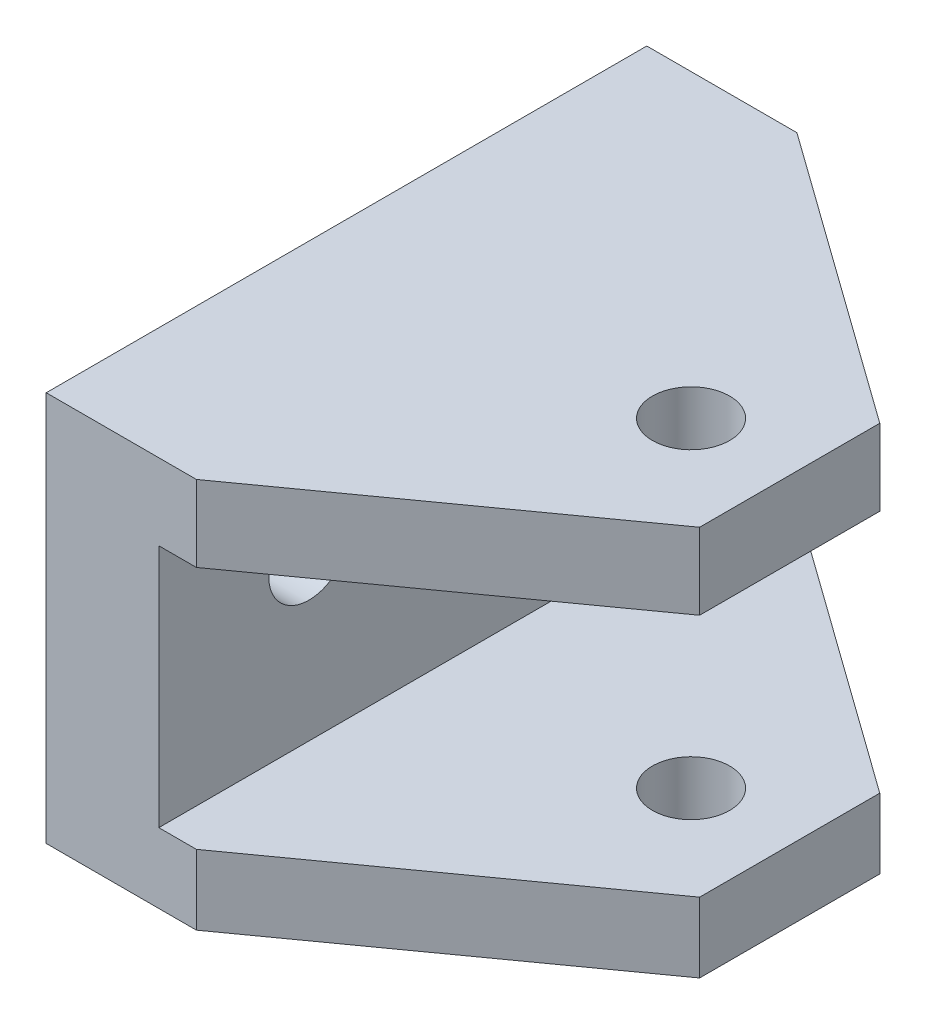
ISO-10303-21;
HEADER;
FILE_DESCRIPTION(('STEP AP214'),'2;1');
FILE_NAME('part.step','',(''),(''),'','','');
FILE_SCHEMA(('AUTOMOTIVE_DESIGN { 1 0 10303 214 1 1 1 1 }'));
ENDSEC;
DATA;
#1=APPLICATION_CONTEXT('core data for automotive mechanical design processes');
#2=APPLICATION_PROTOCOL_DEFINITION('international standard','automotive_design',2000,#1);
#3=PRODUCT_CONTEXT('',#1,'mechanical');
#4=PRODUCT('Part','Part','',(#3));
#5=PRODUCT_RELATED_PRODUCT_CATEGORY('part','',(#4));
#6=PRODUCT_DEFINITION_FORMATION('','',#4);
#7=PRODUCT_DEFINITION_CONTEXT('part definition',#1,'design');
#8=PRODUCT_DEFINITION('design','',#6,#7);
#9=PRODUCT_DEFINITION_SHAPE('','',#8);
#10=(LENGTH_UNIT() NAMED_UNIT(*) SI_UNIT(.MILLI.,.METRE.));
#11=(NAMED_UNIT(*) PLANE_ANGLE_UNIT() SI_UNIT($,.RADIAN.));
#12=(NAMED_UNIT(*) SI_UNIT($,.STERADIAN.) SOLID_ANGLE_UNIT());
#13=UNCERTAINTY_MEASURE_WITH_UNIT(LENGTH_MEASURE(1.E-05),#10,'distance_accuracy_value','');
#14=(GEOMETRIC_REPRESENTATION_CONTEXT(3) GLOBAL_UNCERTAINTY_ASSIGNED_CONTEXT((#13)) GLOBAL_UNIT_ASSIGNED_CONTEXT((#10,
#11,#12)) REPRESENTATION_CONTEXT('',''));
#15=CARTESIAN_POINT('',(0.,0.,0.));
#16=DIRECTION('',(0.,0.,1.));
#17=DIRECTION('',(1.,0.,0.));
#18=AXIS2_PLACEMENT_3D('',#15,#16,#17);
#19=CARTESIAN_POINT('',(0.,1.79164753652166,50.8));
#20=DIRECTION('',(0.,1.,0.));
#21=DIRECTION('',(0.,0.,1.));
#22=AXIS2_PLACEMENT_3D('',#19,#20,#21);
#23=PLANE('',#22);
#24=CARTESIAN_POINT('',(29.1452579658035,1.79164753652166,25.4));
#25=DIRECTION('',(0.,1.,0.));
#26=DIRECTION('',(0.,0.,1.));
#27=AXIS2_PLACEMENT_3D('',#24,#25,#26);
#28=CIRCLE('',#27,3.2639);
#29=CARTESIAN_POINT('',(29.1452579658035,1.79164753652166,28.6639));
#30=VERTEX_POINT('',#29);
#31=EDGE_CURVE('E304',#30,#30,#28,.F.);
#32=ORIENTED_EDGE('',*,*,#31,.F.);
#33=EDGE_LOOP('',(#32));
#34=FACE_BOUND('',#33,.T.);
#35=DIRECTION('',(0.,0.,-1.));
#36=VECTOR('',#35,1.);
#37=CARTESIAN_POINT('',(37.4891579658035,1.79164753652166,17.78));
#38=LINE('',#37,#36);
#39=CARTESIAN_POINT('',(37.4891579658035,1.79164753652166,33.02));
#40=VERTEX_POINT('',#39);
#41=CARTESIAN_POINT('',(37.4891579658035,1.79164753652165,17.78));
#42=VERTEX_POINT('',#41);
#43=EDGE_CURVE('E292',#40,#42,#38,.T.);
#44=ORIENTED_EDGE('',*,*,#43,.F.);
#45=DIRECTION('',(0.812592996843256,0.,-0.582831554980765));
#46=VECTOR('',#45,1.);
#47=CARTESIAN_POINT('',(37.4891579658035,1.79164753652166,33.02));
#48=LINE('',#47,#46);
#49=CARTESIAN_POINT('',(12.7,1.79164753652166,50.8));
#50=VERTEX_POINT('',#49);
#51=EDGE_CURVE('E273',#50,#40,#48,.T.);
#52=ORIENTED_EDGE('',*,*,#51,.F.);
#53=DIRECTION('',(1.,0.,0.));
#54=VECTOR('',#53,1.);
#55=CARTESIAN_POINT('',(0.,1.79164753652166,50.8));
#56=LINE('',#55,#54);
#57=CARTESIAN_POINT('',(0.,1.79164753652166,50.8));
#58=VERTEX_POINT('',#57);
#59=EDGE_CURVE('E165',#58,#50,#56,.T.);
#60=ORIENTED_EDGE('',*,*,#59,.F.);
#61=DIRECTION('',(0.,0.,-1.));
#62=VECTOR('',#61,1.);
#63=CARTESIAN_POINT('',(0.,1.79164753652166,50.8));
#64=LINE('',#63,#62);
#65=CARTESIAN_POINT('',(0.,1.79164753652166,0.));
#66=VERTEX_POINT('',#65);
#67=EDGE_CURVE('E171',#58,#66,#64,.T.);
#68=ORIENTED_EDGE('',*,*,#67,.T.);
#69=DIRECTION('',(1.,0.,0.));
#70=VECTOR('',#69,1.);
#71=CARTESIAN_POINT('',(0.,1.79164753652166,0.));
#72=LINE('',#71,#70);
#73=CARTESIAN_POINT('',(12.7,1.79164753652166,0.));
#74=VERTEX_POINT('',#73);
#75=EDGE_CURVE('E194',#66,#74,#72,.T.);
#76=ORIENTED_EDGE('',*,*,#75,.T.);
#77=DIRECTION('',(-0.812592996843256,0.,-0.582831554980765));
#78=VECTOR('',#77,1.);
#79=CARTESIAN_POINT('',(12.7,1.79164753652166,0.));
#80=LINE('',#79,#78);
#81=EDGE_CURVE('E68',#42,#74,#80,.T.);
#82=ORIENTED_EDGE('',*,*,#81,.F.);
#83=EDGE_LOOP('',(#44,#52,#60,#68,#76,#82));
#84=FACE_BOUND('',#83,.T.);
#85=ADVANCED_FACE('F45',(#34,#84),#23,.F.);
#86=CARTESIAN_POINT('',(9.52499999999999,7.71347230024182,50.8));
#87=DIRECTION('',(4.66310559007069E-13,-1.,0.));
#88=DIRECTION('',(1.,4.66310559007069E-13,0.));
#89=AXIS2_PLACEMENT_3D('',#86,#87,#88);
#90=PLANE('',#89);
#91=CARTESIAN_POINT('',(29.1452579658035,7.71347230025096,25.4));
#92=DIRECTION('',(4.66310559007069E-13,-1.,0.));
#93=DIRECTION('',(1.,4.66310559007069E-13,0.));
#94=AXIS2_PLACEMENT_3D('',#91,#92,#93);
#95=CIRCLE('',#94,3.2639);
#96=CARTESIAN_POINT('',(29.1452579658035,7.71347230025096,28.6639));
#97=VERTEX_POINT('',#96);
#98=EDGE_CURVE('E241',#97,#97,#95,.T.);
#99=ORIENTED_EDGE('',*,*,#98,.T.);
#100=EDGE_LOOP('',(#99));
#101=FACE_BOUND('',#100,.T.);
#102=DIRECTION('',(-1.,-4.66310559007069E-13,0.));
#103=VECTOR('',#102,1.);
#104=CARTESIAN_POINT('',(9.52499999999999,7.71347230024182,50.8));
#105=LINE('',#104,#103);
#106=CARTESIAN_POINT('',(12.7,7.71347230024932,50.8));
#107=VERTEX_POINT('',#106);
#108=CARTESIAN_POINT('',(9.52499999999999,7.71347230024182,50.8));
#109=VERTEX_POINT('',#108);
#110=EDGE_CURVE('E229',#107,#109,#105,.T.);
#111=ORIENTED_EDGE('',*,*,#110,.F.);
#112=DIRECTION('',(0.812592996843256,3.78920694603208E-13,-0.582831554980765));
#113=VECTOR('',#112,1.);
#114=CARTESIAN_POINT('',(10.6035240732031,7.71347230024233,52.3036953667353));
#115=LINE('',#114,#113);
#116=CARTESIAN_POINT('',(37.4891579658035,7.71347230025483,33.02));
#117=VERTEX_POINT('',#116);
#118=EDGE_CURVE('E259',#107,#117,#115,.T.);
#119=ORIENTED_EDGE('',*,*,#118,.T.);
#120=DIRECTION('',(0.,0.,-1.));
#121=VECTOR('',#120,1.);
#122=CARTESIAN_POINT('',(37.4891579658035,7.71347230025486,50.8));
#123=LINE('',#122,#121);
#124=CARTESIAN_POINT('',(37.4891579658035,7.71347230024906,17.78));
#125=VERTEX_POINT('',#124);
#126=EDGE_CURVE('E252',#117,#125,#123,.T.);
#127=ORIENTED_EDGE('',*,*,#126,.T.);
#128=DIRECTION('',(-0.812592996843256,-3.78920694603208E-13,-0.582831554980765));
#129=VECTOR('',#128,1.);
#130=CARTESIAN_POINT('',(34.6626499409682,7.71347230025354,15.7526898045146));
#131=LINE('',#130,#129);
#132=CARTESIAN_POINT('',(12.7,7.71347230024932,0.));
#133=VERTEX_POINT('',#132);
#134=EDGE_CURVE('E265',#125,#133,#131,.T.);
#135=ORIENTED_EDGE('',*,*,#134,.T.);
#136=DIRECTION('',(-1.,-4.66310559007069E-13,0.));
#137=VECTOR('',#136,1.);
#138=CARTESIAN_POINT('',(9.52499999999999,7.71347230024182,0.));
#139=LINE('',#138,#137);
#140=CARTESIAN_POINT('',(9.52499999999999,7.71347230024182,0.));
#141=VERTEX_POINT('',#140);
#142=EDGE_CURVE('E199',#133,#141,#139,.T.);
#143=ORIENTED_EDGE('',*,*,#142,.T.);
#144=DIRECTION('',(0.,0.,-1.));
#145=VECTOR('',#144,1.);
#146=CARTESIAN_POINT('',(9.52499999999999,7.71347230024182,50.8));
#147=LINE('',#146,#145);
#148=EDGE_CURVE('E143',#109,#141,#147,.T.);
#149=ORIENTED_EDGE('',*,*,#148,.F.);
#150=EDGE_LOOP('',(#111,#119,#127,#135,#143,#149));
#151=FACE_BOUND('',#150,.T.);
#152=ADVANCED_FACE('F313',(#101,#151),#90,.F.);
#153=CARTESIAN_POINT('',(9.52499999999998,28.3636723002418,50.8));
#154=DIRECTION('',(-1.,0.,0.));
#155=DIRECTION('',(0.,-1.,0.));
#156=AXIS2_PLACEMENT_3D('',#153,#154,#155);
#157=PLANE('',#156);
#158=CARTESIAN_POINT('',(9.52499999999999,21.4304608809537,38.1));
#159=DIRECTION('',(1.,0.,0.));
#160=DIRECTION('',(0.,0.,-1.));
#161=AXIS2_PLACEMENT_3D('',#158,#159,#160);
#162=CIRCLE('',#161,3.4);
#163=CARTESIAN_POINT('',(9.52499999999999,21.4304608809537,34.7));
#164=VERTEX_POINT('',#163);
#165=EDGE_CURVE('E191',#164,#164,#162,.T.);
#166=ORIENTED_EDGE('',*,*,#165,.F.);
#167=EDGE_LOOP('',(#166));
#168=FACE_BOUND('',#167,.T.);
#169=CARTESIAN_POINT('',(9.52499999999999,21.4304608809537,12.7));
#170=DIRECTION('',(1.,0.,0.));
#171=DIRECTION('',(0.,0.,-1.));
#172=AXIS2_PLACEMENT_3D('',#169,#170,#171);
#173=CIRCLE('',#172,3.4);
#174=CARTESIAN_POINT('',(9.52499999999999,21.4304608809537,9.3));
#175=VERTEX_POINT('',#174);
#176=EDGE_CURVE('E237',#175,#175,#173,.T.);
#177=ORIENTED_EDGE('',*,*,#176,.F.);
#178=EDGE_LOOP('',(#177));
#179=FACE_BOUND('',#178,.T.);
#180=DIRECTION('',(0.,1.,0.));
#181=VECTOR('',#180,1.);
#182=CARTESIAN_POINT('',(9.52499999999998,28.3636723002418,0.));
#183=LINE('',#182,#181);
#184=CARTESIAN_POINT('',(9.52499999999998,28.3636723002418,0.));
#185=VERTEX_POINT('',#184);
#186=EDGE_CURVE('E167',#141,#185,#183,.T.);
#187=ORIENTED_EDGE('',*,*,#186,.T.);
#188=DIRECTION('',(0.,0.,-1.));
#189=VECTOR('',#188,1.);
#190=CARTESIAN_POINT('',(9.52499999999998,28.3636723002418,50.8));
#191=LINE('',#190,#189);
#192=CARTESIAN_POINT('',(9.52499999999998,28.3636723002418,50.8));
#193=VERTEX_POINT('',#192);
#194=EDGE_CURVE('E179',#193,#185,#191,.T.);
#195=ORIENTED_EDGE('',*,*,#194,.F.);
#196=DIRECTION('',(0.,1.,0.));
#197=VECTOR('',#196,1.);
#198=CARTESIAN_POINT('',(9.52499999999998,28.3636723002418,50.8));
#199=LINE('',#198,#197);
#200=EDGE_CURVE('E225',#109,#193,#199,.T.);
#201=ORIENTED_EDGE('',*,*,#200,.F.);
#202=ORIENTED_EDGE('',*,*,#148,.T.);
#203=EDGE_LOOP('',(#187,#195,#201,#202));
#204=FACE_BOUND('',#203,.T.);
#205=ADVANCED_FACE('F210',(#168,#179,#204),#157,.F.);
#206=CARTESIAN_POINT('',(41.8452579658035,28.3636723002569,50.8));
#207=DIRECTION('',(-4.66417904900026E-13,1.,0.));
#208=DIRECTION('',(-1.,-4.66417904900026E-13,0.));
#209=AXIS2_PLACEMENT_3D('',#206,#207,#208);
#210=PLANE('',#209);
#211=CARTESIAN_POINT('',(29.1452579658035,28.363672300251,25.4));
#212=DIRECTION('',(-4.66417904900026E-13,1.,0.));
#213=DIRECTION('',(-1.,-4.66417904900026E-13,0.));
#214=AXIS2_PLACEMENT_3D('',#211,#212,#213);
#215=CIRCLE('',#214,3.2639);
#216=CARTESIAN_POINT('',(29.1452579658035,28.363672300251,28.6639));
#217=VERTEX_POINT('',#216);
#218=EDGE_CURVE('E248',#217,#217,#215,.T.);
#219=ORIENTED_EDGE('',*,*,#218,.T.);
#220=EDGE_LOOP('',(#219));
#221=FACE_BOUND('',#220,.T.);
#222=DIRECTION('',(0.,0.,1.));
#223=VECTOR('',#222,1.);
#224=CARTESIAN_POINT('',(37.4891579658035,28.3636723002549,50.8));
#225=LINE('',#224,#223);
#226=CARTESIAN_POINT('',(37.4891579658035,28.363672300249,17.78));
#227=VERTEX_POINT('',#226);
#228=CARTESIAN_POINT('',(37.4891579658035,28.3636723002548,33.02));
#229=VERTEX_POINT('',#228);
#230=EDGE_CURVE('E256',#227,#229,#225,.T.);
#231=ORIENTED_EDGE('',*,*,#230,.T.);
#232=DIRECTION('',(-0.812592996843256,-3.79007923124065E-13,0.582831554980765));
#233=VECTOR('',#232,1.);
#234=CARTESIAN_POINT('',(31.9448288836511,28.3636723002523,36.9966647667766));
#235=LINE('',#234,#233);
#236=CARTESIAN_POINT('',(12.7,28.3636723002493,50.8));
#237=VERTEX_POINT('',#236);
#238=EDGE_CURVE('E221',#229,#237,#235,.T.);
#239=ORIENTED_EDGE('',*,*,#238,.T.);
#240=DIRECTION('',(1.,4.66417904900026E-13,0.));
#241=VECTOR('',#240,1.);
#242=CARTESIAN_POINT('',(41.8452579658035,28.3636723002569,50.8));
#243=LINE('',#242,#241);
#244=EDGE_CURVE('E220',#193,#237,#243,.T.);
#245=ORIENTED_EDGE('',*,*,#244,.F.);
#246=ORIENTED_EDGE('',*,*,#194,.T.);
#247=DIRECTION('',(1.,4.66417904900026E-13,0.));
#248=VECTOR('',#247,1.);
#249=CARTESIAN_POINT('',(41.8452579658035,28.3636723002569,0.));
#250=LINE('',#249,#248);
#251=CARTESIAN_POINT('',(12.7,28.3636723002433,0.));
#252=VERTEX_POINT('',#251);
#253=EDGE_CURVE('E161',#185,#252,#250,.T.);
#254=ORIENTED_EDGE('',*,*,#253,.T.);
#255=DIRECTION('',(0.812592996843256,3.79007923124065E-13,0.582831554980765));
#256=VECTOR('',#255,1.);
#257=CARTESIAN_POINT('',(56.0039547514161,28.3636723002635,31.0597204044733));
#258=LINE('',#257,#256);
#259=EDGE_CURVE('E60',#252,#227,#258,.T.);
#260=ORIENTED_EDGE('',*,*,#259,.T.);
#261=EDGE_LOOP('',(#231,#239,#245,#246,#254,#260));
#262=FACE_BOUND('',#261,.T.);
#263=ADVANCED_FACE('F217',(#221,#262),#210,.F.);
#264=CARTESIAN_POINT('',(0.,34.8116475365217,50.8));
#265=DIRECTION('',(0.,-1.,0.));
#266=DIRECTION('',(0.,0.,-1.));
#267=AXIS2_PLACEMENT_3D('',#264,#265,#266);
#268=PLANE('',#267);
#269=CARTESIAN_POINT('',(29.1452579658035,34.8116475365217,25.4));
#270=DIRECTION('',(0.,1.,0.));
#271=DIRECTION('',(0.,0.,1.));
#272=AXIS2_PLACEMENT_3D('',#269,#270,#271);
#273=CIRCLE('',#272,3.2639);
#274=CARTESIAN_POINT('',(29.1452579658035,34.8116475365217,28.6639));
#275=VERTEX_POINT('',#274);
#276=EDGE_CURVE('E154',#275,#275,#273,.T.);
#277=ORIENTED_EDGE('',*,*,#276,.F.);
#278=EDGE_LOOP('',(#277));
#279=FACE_BOUND('',#278,.T.);
#280=DIRECTION('',(-1.,0.,0.));
#281=VECTOR('',#280,1.);
#282=CARTESIAN_POINT('',(0.,34.8116475365217,50.8));
#283=LINE('',#282,#281);
#284=CARTESIAN_POINT('',(12.7,34.8116475365217,50.8));
#285=VERTEX_POINT('',#284);
#286=CARTESIAN_POINT('',(0.,34.8116475365217,50.8));
#287=VERTEX_POINT('',#286);
#288=EDGE_CURVE('E224',#285,#287,#283,.T.);
#289=ORIENTED_EDGE('',*,*,#288,.F.);
#290=DIRECTION('',(-0.812592996843256,0.,0.582831554980765));
#291=VECTOR('',#290,1.);
#292=CARTESIAN_POINT('',(37.4891579658035,34.8116475365217,33.02));
#293=LINE('',#292,#291);
#294=CARTESIAN_POINT('',(37.4891579658035,34.8116475365217,33.02));
#295=VERTEX_POINT('',#294);
#296=EDGE_CURVE('E278',#295,#285,#293,.T.);
#297=ORIENTED_EDGE('',*,*,#296,.F.);
#298=DIRECTION('',(0.,0.,1.));
#299=VECTOR('',#298,1.);
#300=CARTESIAN_POINT('',(37.4891579658035,34.8116475365217,17.78));
#301=LINE('',#300,#299);
#302=CARTESIAN_POINT('',(37.4891579658035,34.8116475365217,17.78));
#303=VERTEX_POINT('',#302);
#304=EDGE_CURVE('E152',#303,#295,#301,.T.);
#305=ORIENTED_EDGE('',*,*,#304,.F.);
#306=DIRECTION('',(0.812592996843256,0.,0.582831554980765));
#307=VECTOR('',#306,1.);
#308=CARTESIAN_POINT('',(12.7,34.8116475365217,0.));
#309=LINE('',#308,#307);
#310=CARTESIAN_POINT('',(12.7,34.8116475365217,0.));
#311=VERTEX_POINT('',#310);
#312=EDGE_CURVE('E136',#311,#303,#309,.T.);
#313=ORIENTED_EDGE('',*,*,#312,.F.);
#314=DIRECTION('',(-1.,0.,0.));
#315=VECTOR('',#314,1.);
#316=CARTESIAN_POINT('',(0.,34.8116475365217,0.));
#317=LINE('',#316,#315);
#318=CARTESIAN_POINT('',(0.,34.8116475365217,0.));
#319=VERTEX_POINT('',#318);
#320=EDGE_CURVE('E148',#311,#319,#317,.T.);
#321=ORIENTED_EDGE('',*,*,#320,.T.);
#322=DIRECTION('',(0.,0.,-1.));
#323=VECTOR('',#322,1.);
#324=CARTESIAN_POINT('',(0.,34.8116475365217,50.8));
#325=LINE('',#324,#323);
#326=EDGE_CURVE('E175',#287,#319,#325,.T.);
#327=ORIENTED_EDGE('',*,*,#326,.F.);
#328=EDGE_LOOP('',(#289,#297,#305,#313,#321,#327));
#329=FACE_BOUND('',#328,.T.);
#330=ADVANCED_FACE('F146',(#279,#329),#268,.F.);
#331=CARTESIAN_POINT('',(0.,1.79164753652166,50.8));
#332=DIRECTION('',(1.,0.,0.));
#333=DIRECTION('',(0.,0.,-1.));
#334=AXIS2_PLACEMENT_3D('',#331,#332,#333);
#335=PLANE('',#334);
#336=CARTESIAN_POINT('',(0.,21.4304608809537,38.1));
#337=DIRECTION('',(1.,0.,0.));
#338=DIRECTION('',(0.,0.,-1.));
#339=AXIS2_PLACEMENT_3D('',#336,#337,#338);
#340=CIRCLE('',#339,3.4);
#341=CARTESIAN_POINT('',(0.,21.4304608809537,34.7));
#342=VERTEX_POINT('',#341);
#343=EDGE_CURVE('E190',#342,#342,#340,.T.);
#344=ORIENTED_EDGE('',*,*,#343,.T.);
#345=EDGE_LOOP('',(#344));
#346=FACE_BOUND('',#345,.T.);
#347=CARTESIAN_POINT('',(0.,21.4304608809537,12.7));
#348=DIRECTION('',(1.,0.,0.));
#349=DIRECTION('',(0.,0.,-1.));
#350=AXIS2_PLACEMENT_3D('',#347,#348,#349);
#351=CIRCLE('',#350,3.4);
#352=CARTESIAN_POINT('',(0.,21.4304608809537,9.3));
#353=VERTEX_POINT('',#352);
#354=EDGE_CURVE('E186',#353,#353,#351,.T.);
#355=ORIENTED_EDGE('',*,*,#354,.T.);
#356=EDGE_LOOP('',(#355));
#357=FACE_BOUND('',#356,.T.);
#358=DIRECTION('',(0.,-1.,0.));
#359=VECTOR('',#358,1.);
#360=CARTESIAN_POINT('',(0.,1.79164753652166,0.));
#361=LINE('',#360,#359);
#362=EDGE_CURVE('E159',#319,#66,#361,.T.);
#363=ORIENTED_EDGE('',*,*,#362,.T.);
#364=ORIENTED_EDGE('',*,*,#67,.F.);
#365=DIRECTION('',(0.,-1.,0.));
#366=VECTOR('',#365,1.);
#367=CARTESIAN_POINT('',(0.,1.79164753652166,50.8));
#368=LINE('',#367,#366);
#369=EDGE_CURVE('E176',#287,#58,#368,.T.);
#370=ORIENTED_EDGE('',*,*,#369,.F.);
#371=ORIENTED_EDGE('',*,*,#326,.T.);
#372=EDGE_LOOP('',(#363,#364,#370,#371));
#373=FACE_BOUND('',#372,.T.);
#374=ADVANCED_FACE('F329',(#346,#357,#373),#335,.F.);
#375=CARTESIAN_POINT('',(0.,0.,50.8));
#376=DIRECTION('',(0.,0.,-1.));
#377=DIRECTION('',(-1.,0.,0.));
#378=AXIS2_PLACEMENT_3D('',#375,#376,#377);
#379=PLANE('',#378);
#380=ORIENTED_EDGE('',*,*,#59,.T.);
#381=DIRECTION('',(0.,1.,0.));
#382=VECTOR('',#381,1.);
#383=CARTESIAN_POINT('',(12.7,-56.7752890565189,50.8));
#384=LINE('',#383,#382);
#385=EDGE_CURVE('E288',#50,#107,#384,.T.);
#386=ORIENTED_EDGE('',*,*,#385,.T.);
#387=ORIENTED_EDGE('',*,*,#110,.T.);
#388=ORIENTED_EDGE('',*,*,#200,.T.);
#389=ORIENTED_EDGE('',*,*,#244,.T.);
#390=DIRECTION('',(0.,1.,0.));
#391=VECTOR('',#390,1.);
#392=CARTESIAN_POINT('',(12.7,0.,50.8));
#393=LINE('',#392,#391);
#394=EDGE_CURVE('E11',#237,#285,#393,.T.);
#395=ORIENTED_EDGE('',*,*,#394,.T.);
#396=ORIENTED_EDGE('',*,*,#288,.T.);
#397=ORIENTED_EDGE('',*,*,#369,.T.);
#398=EDGE_LOOP('',(#380,#386,#387,#388,#389,#395,#396,#397));
#399=FACE_BOUND('',#398,.T.);
#400=ADVANCED_FACE('F325',(#399),#379,.F.);
#401=CARTESIAN_POINT('',(0.,0.,0.));
#402=DIRECTION('',(0.,0.,-1.));
#403=DIRECTION('',(-1.,0.,0.));
#404=AXIS2_PLACEMENT_3D('',#401,#402,#403);
#405=PLANE('',#404);
#406=DIRECTION('',(0.,1.,0.));
#407=VECTOR('',#406,1.);
#408=CARTESIAN_POINT('',(12.7,-56.7752890565189,0.));
#409=LINE('',#408,#407);
#410=EDGE_CURVE('E274',#74,#133,#409,.T.);
#411=ORIENTED_EDGE('',*,*,#410,.F.);
#412=ORIENTED_EDGE('',*,*,#75,.F.);
#413=ORIENTED_EDGE('',*,*,#362,.F.);
#414=ORIENTED_EDGE('',*,*,#320,.F.);
#415=DIRECTION('',(0.,1.,0.));
#416=VECTOR('',#415,1.);
#417=CARTESIAN_POINT('',(12.7,0.,0.));
#418=LINE('',#417,#416);
#419=EDGE_CURVE('E53',#252,#311,#418,.T.);
#420=ORIENTED_EDGE('',*,*,#419,.F.);
#421=ORIENTED_EDGE('',*,*,#253,.F.);
#422=ORIENTED_EDGE('',*,*,#186,.F.);
#423=ORIENTED_EDGE('',*,*,#142,.F.);
#424=EDGE_LOOP('',(#411,#412,#413,#414,#420,#421,#422,#423));
#425=FACE_BOUND('',#424,.T.);
#426=ADVANCED_FACE('F157',(#425),#405,.T.);
#427=CARTESIAN_POINT('',(-41.275,21.4304608809537,12.7));
#428=DIRECTION('',(1.,0.,0.));
#429=DIRECTION('',(0.,0.,-1.));
#430=AXIS2_PLACEMENT_3D('',#427,#428,#429);
#431=CYLINDRICAL_SURFACE('',#430,3.4);
#432=ORIENTED_EDGE('',*,*,#176,.T.);
#433=EDGE_LOOP('',(#432));
#434=FACE_BOUND('',#433,.T.);
#435=ORIENTED_EDGE('',*,*,#354,.F.);
#436=EDGE_LOOP('',(#435));
#437=FACE_BOUND('',#436,.T.);
#438=ADVANCED_FACE('F352',(#434,#437),#431,.F.);
#439=CARTESIAN_POINT('',(-41.275,21.4304608809537,38.1));
#440=DIRECTION('',(1.,0.,0.));
#441=DIRECTION('',(0.,0.,-1.));
#442=AXIS2_PLACEMENT_3D('',#439,#440,#441);
#443=CYLINDRICAL_SURFACE('',#442,3.4);
#444=ORIENTED_EDGE('',*,*,#165,.T.);
#445=EDGE_LOOP('',(#444));
#446=FACE_BOUND('',#445,.T.);
#447=ORIENTED_EDGE('',*,*,#343,.F.);
#448=EDGE_LOOP('',(#447));
#449=FACE_BOUND('',#448,.T.);
#450=ADVANCED_FACE('F349',(#446,#449),#443,.F.);
#451=CARTESIAN_POINT('',(37.4891579658035,-56.7752890565189,33.02));
#452=DIRECTION('',(-0.582831554980765,0.,-0.812592996843256));
#453=DIRECTION('',(-0.812592996843256,0.,0.582831554980765));
#454=AXIS2_PLACEMENT_3D('',#451,#452,#453);
#455=PLANE('',#454);
#456=DIRECTION('',(0.,1.,0.));
#457=VECTOR('',#456,1.);
#458=CARTESIAN_POINT('',(37.4891579658035,-56.7752890565189,33.02));
#459=LINE('',#458,#457);
#460=EDGE_CURVE('E283',#229,#295,#459,.T.);
#461=ORIENTED_EDGE('',*,*,#460,.T.);
#462=ORIENTED_EDGE('',*,*,#296,.T.);
#463=ORIENTED_EDGE('',*,*,#394,.F.);
#464=ORIENTED_EDGE('',*,*,#238,.F.);
#465=EDGE_LOOP('',(#461,#462,#463,#464));
#466=FACE_BOUND('',#465,.T.);
#467=ADVANCED_FACE('F331',(#466),#455,.F.);
#468=CARTESIAN_POINT('',(12.7,-56.7752890565189,0.));
#469=DIRECTION('',(-0.582831554980765,0.,0.812592996843256));
#470=DIRECTION('',(0.812592996843256,0.,0.582831554980765));
#471=AXIS2_PLACEMENT_3D('',#468,#469,#470);
#472=PLANE('',#471);
#473=ORIENTED_EDGE('',*,*,#419,.T.);
#474=ORIENTED_EDGE('',*,*,#312,.T.);
#475=DIRECTION('',(0.,1.,0.));
#476=VECTOR('',#475,1.);
#477=CARTESIAN_POINT('',(37.4891579658035,-56.7752890565189,17.78));
#478=LINE('',#477,#476);
#479=EDGE_CURVE('E277',#227,#303,#478,.T.);
#480=ORIENTED_EDGE('',*,*,#479,.F.);
#481=ORIENTED_EDGE('',*,*,#259,.F.);
#482=EDGE_LOOP('',(#473,#474,#480,#481));
#483=FACE_BOUND('',#482,.T.);
#484=ADVANCED_FACE('F135',(#483),#472,.F.);
#485=CARTESIAN_POINT('',(37.4891579658035,-56.7752890565189,17.78));
#486=DIRECTION('',(-1.,0.,0.));
#487=DIRECTION('',(0.,0.,1.));
#488=AXIS2_PLACEMENT_3D('',#485,#486,#487);
#489=PLANE('',#488);
#490=ORIENTED_EDGE('',*,*,#479,.T.);
#491=ORIENTED_EDGE('',*,*,#304,.T.);
#492=ORIENTED_EDGE('',*,*,#460,.F.);
#493=ORIENTED_EDGE('',*,*,#230,.F.);
#494=EDGE_LOOP('',(#490,#491,#492,#493));
#495=FACE_BOUND('',#494,.T.);
#496=ADVANCED_FACE('F335',(#495),#489,.F.);
#497=EDGE_CURVE('E284',#40,#117,#459,.T.);
#498=ORIENTED_EDGE('',*,*,#497,.F.);
#499=ORIENTED_EDGE('',*,*,#43,.T.);
#500=EDGE_CURVE('E279',#42,#125,#478,.T.);
#501=ORIENTED_EDGE('',*,*,#500,.T.);
#502=ORIENTED_EDGE('',*,*,#126,.F.);
#503=EDGE_LOOP('',(#498,#499,#501,#502));
#504=FACE_BOUND('',#503,.T.);
#505=ADVANCED_FACE('F319',(#504),#489,.F.);
#506=ORIENTED_EDGE('',*,*,#385,.F.);
#507=ORIENTED_EDGE('',*,*,#51,.T.);
#508=ORIENTED_EDGE('',*,*,#497,.T.);
#509=ORIENTED_EDGE('',*,*,#118,.F.);
#510=EDGE_LOOP('',(#506,#507,#508,#509));
#511=FACE_BOUND('',#510,.T.);
#512=ADVANCED_FACE('F324',(#511),#455,.F.);
#513=ORIENTED_EDGE('',*,*,#500,.F.);
#514=ORIENTED_EDGE('',*,*,#81,.T.);
#515=ORIENTED_EDGE('',*,*,#410,.T.);
#516=ORIENTED_EDGE('',*,*,#134,.F.);
#517=EDGE_LOOP('',(#513,#514,#515,#516));
#518=FACE_BOUND('',#517,.T.);
#519=ADVANCED_FACE('F320',(#518),#472,.F.);
#520=CARTESIAN_POINT('',(29.1452579658035,-56.7752890565189,25.4));
#521=DIRECTION('',(0.,1.,0.));
#522=DIRECTION('',(0.,0.,1.));
#523=AXIS2_PLACEMENT_3D('',#520,#521,#522);
#524=CYLINDRICAL_SURFACE('',#523,3.2639);
#525=CARTESIAN_POINT('',(29.1452579658035,34.8116475365217,28.6639));
#526=CARTESIAN_POINT('',(29.1452579658035,34.7444811278105,28.6639));
#527=CARTESIAN_POINT('',(29.1452579658035,34.6773147190994,28.6639));
#528=CARTESIAN_POINT('',(29.1452579658035,34.5429819016771,28.6639));
#529=CARTESIAN_POINT('',(29.1452579658035,34.4758154929659,28.6639));
#530=CARTESIAN_POINT('',(29.1452579658035,34.3414826755436,28.6639));
#531=CARTESIAN_POINT('',(29.1452579658035,34.2743162668324,28.6639));
#532=CARTESIAN_POINT('',(29.1452579658035,34.1399834494101,28.6639));
#533=CARTESIAN_POINT('',(29.1452579658035,34.072817040699,28.6639));
#534=CARTESIAN_POINT('',(29.1452579658035,33.9384842232767,28.6639));
#535=CARTESIAN_POINT('',(29.1452579658035,33.8713178145655,28.6639));
#536=CARTESIAN_POINT('',(29.1452579658035,33.7369849971432,28.6639));
#537=CARTESIAN_POINT('',(29.1452579658035,33.6698185884321,28.6639));
#538=CARTESIAN_POINT('',(29.1452579658035,33.5354857710098,28.6639));
#539=CARTESIAN_POINT('',(29.1452579658035,33.4683193622986,28.6639));
#540=CARTESIAN_POINT('',(29.1452579658035,33.3339865448763,28.6639));
#541=CARTESIAN_POINT('',(29.1452579658035,33.2668201361651,28.6639));
#542=CARTESIAN_POINT('',(29.1452579658035,33.1324873187428,28.6639));
#543=CARTESIAN_POINT('',(29.1452579658035,33.0653209100317,28.6639));
#544=CARTESIAN_POINT('',(29.1452579658035,32.9309880926094,28.6639));
#545=CARTESIAN_POINT('',(29.1452579658035,32.8638216838982,28.6639));
#546=CARTESIAN_POINT('',(29.1452579658035,32.7294888664759,28.6639));
#547=CARTESIAN_POINT('',(29.1452579658035,32.6623224577648,28.6639));
#548=CARTESIAN_POINT('',(29.1452579658035,32.5279896403425,28.6639));
#549=CARTESIAN_POINT('',(29.1452579658035,32.4608232316313,28.6639));
#550=CARTESIAN_POINT('',(29.1452579658035,32.326490414209,28.6639));
#551=CARTESIAN_POINT('',(29.1452579658035,32.2593240054978,28.6639));
#552=CARTESIAN_POINT('',(29.1452579658035,32.1249911880755,28.6639));
#553=CARTESIAN_POINT('',(29.1452579658035,32.0578247793644,28.6639));
#554=CARTESIAN_POINT('',(29.1452579658035,31.9234919619421,28.6639));
#555=CARTESIAN_POINT('',(29.1452579658035,31.8563255532309,28.6639));
#556=CARTESIAN_POINT('',(29.1452579658035,31.7219927358086,28.6639));
#557=CARTESIAN_POINT('',(29.1452579658035,31.6548263270975,28.6639));
#558=CARTESIAN_POINT('',(29.1452579658035,31.5204935096752,28.6639));
#559=CARTESIAN_POINT('',(29.1452579658035,31.453327100964,28.6639));
#560=CARTESIAN_POINT('',(29.1452579658035,31.3189942835417,28.6639));
#561=CARTESIAN_POINT('',(29.1452579658035,31.2518278748305,28.6639));
#562=CARTESIAN_POINT('',(29.1452579658035,31.1174950574082,28.6639));
#563=CARTESIAN_POINT('',(29.1452579658035,31.0503286486971,28.6639));
#564=CARTESIAN_POINT('',(29.1452579658035,30.9159958312748,28.6639));
#565=CARTESIAN_POINT('',(29.1452579658035,30.8488294225636,28.6639));
#566=CARTESIAN_POINT('',(29.1452579658035,30.7144966051413,28.6639));
#567=CARTESIAN_POINT('',(29.1452579658035,30.6473301964302,28.6639));
#568=CARTESIAN_POINT('',(29.1452579658035,30.5129973790079,28.6639));
#569=CARTESIAN_POINT('',(29.1452579658035,30.4458309702967,28.6639));
#570=CARTESIAN_POINT('',(29.1452579658035,30.3114981528744,28.6639));
#571=CARTESIAN_POINT('',(29.1452579658035,30.2443317441633,28.6639));
#572=CARTESIAN_POINT('',(29.1452579658035,30.1099989267409,28.6639));
#573=CARTESIAN_POINT('',(29.1452579658035,30.0428325180298,28.6639));
#574=CARTESIAN_POINT('',(29.1452579658035,29.9084997006075,28.6639));
#575=CARTESIAN_POINT('',(29.1452579658035,29.8413332918963,28.6639));
#576=CARTESIAN_POINT('',(29.1452579658035,29.707000474474,28.6639));
#577=CARTESIAN_POINT('',(29.1452579658035,29.6398340657629,28.6639));
#578=CARTESIAN_POINT('',(29.1452579658035,29.5055012483406,28.6639));
#579=CARTESIAN_POINT('',(29.1452579658035,29.4383348396294,28.6639));
#580=CARTESIAN_POINT('',(29.1452579658035,29.3040020222071,28.6639));
#581=CARTESIAN_POINT('',(29.1452579658035,29.236835613496,28.6639));
#582=CARTESIAN_POINT('',(29.1452579658035,29.1025027960737,28.6639));
#583=CARTESIAN_POINT('',(29.1452579658035,29.0353363873625,28.6639));
#584=CARTESIAN_POINT('',(29.1452579658035,28.9010035699402,28.6639));
#585=CARTESIAN_POINT('',(29.1452579658035,28.833837161229,28.6639));
#586=CARTESIAN_POINT('',(29.1452579658035,28.6995043438067,28.6639));
#587=CARTESIAN_POINT('',(29.1452579658035,28.6323379350956,28.6639));
#588=CARTESIAN_POINT('',(29.1452579658035,28.4980051176733,28.6639));
#589=CARTESIAN_POINT('',(29.1452579658035,28.4308387089621,28.6639));
#590=CARTESIAN_POINT('',(29.1452579658035,28.363672300251,28.6639));
#591=B_SPLINE_CURVE_WITH_KNOTS('',3,(#525,#526,#527,#528,#529,#530,#531,#532,#533,#534,#535,
#536,#537,#538,#539,#540,#541,#542,#543,#544,#545,#546,#547,#548,#549,#550,#551,#552,#553,#554,
#555,#556,#557,#558,#559,#560,#561,#562,#563,#564,#565,#566,#567,#568,#569,#570,#571,#572,#573,
#574,#575,#576,#577,#578,#579,#580,#581,#582,#583,#584,#585,#586,#587,#588,#589,#590),
.UNSPECIFIED.,.F.,.F.,(4,2,2,2,2,2,2,2,2,2,2,2,2,2,2,2,2,2,2,2,2,2,2,2,2,2,2,2,2,2,2,2,4),(0.,
0.201499226133453,0.40299845226692,0.604497678400373,0.80599690453384,1.00749613066729,
1.20899535680076,1.41049458293421,1.61199380906768,1.81349303520113,2.01499226133459,
2.21649148746805,2.41799071360151,2.61948993973497,2.82098916586843,3.02248839200189,
3.22398761813535,3.4254868442688,3.62698607040227,3.82848529653572,4.02998452266919,
4.23148374880264,4.43298297493611,4.63448220106956,4.83598142720301,5.03748065333648,
5.23897987946993,5.4404791056034,5.64197833173685,5.84347755787032,6.04497678400377,
6.24647601013724,6.44797523627069),.UNSPECIFIED.);
#592=EDGE_CURVE('BSEAM348',#275,#217,#591,.T.);
#593=ORIENTED_EDGE('',*,*,#276,.T.);
#594=ORIENTED_EDGE('',*,*,#218,.F.);
#595=ORIENTED_EDGE('',*,*,#592,.T.);
#596=ORIENTED_EDGE('',*,*,#592,.F.);
#597=EDGE_LOOP('',(#593,#595,#594,#596));
#598=FACE_BOUND('',#597,.T.);
#599=ADVANCED_FACE('F348',(#598),#524,.F.);
#600=CARTESIAN_POINT('',(29.1452579658035,1.79164753652166,28.6639));
#601=CARTESIAN_POINT('',(29.1452579658035,1.85333321114384,28.6639));
#602=CARTESIAN_POINT('',(29.1452579658035,1.91501888576602,28.6639));
#603=CARTESIAN_POINT('',(29.1452579658035,2.03839023501038,28.6639));
#604=CARTESIAN_POINT('',(29.1452579658035,2.10007590963256,28.6639));
#605=CARTESIAN_POINT('',(29.1452579658035,2.22344725887692,28.6639));
#606=CARTESIAN_POINT('',(29.1452579658035,2.2851329334991,28.6639));
#607=CARTESIAN_POINT('',(29.1452579658035,2.40850428274346,28.6639));
#608=CARTESIAN_POINT('',(29.1452579658035,2.47018995736564,28.6639));
#609=CARTESIAN_POINT('',(29.1452579658035,2.59356130661,28.6639));
#610=CARTESIAN_POINT('',(29.1452579658035,2.65524698123218,28.6639));
#611=CARTESIAN_POINT('',(29.1452579658035,2.77861833047654,28.6639));
#612=CARTESIAN_POINT('',(29.1452579658035,2.84030400509872,28.6639));
#613=CARTESIAN_POINT('',(29.1452579658035,2.96367535434309,28.6639));
#614=CARTESIAN_POINT('',(29.1452579658035,3.02536102896527,28.6639));
#615=CARTESIAN_POINT('',(29.1452579658035,3.14873237820963,28.6639));
#616=CARTESIAN_POINT('',(29.1452579658035,3.21041805283181,28.6639));
#617=CARTESIAN_POINT('',(29.1452579658035,3.33378940207617,28.6639));
#618=CARTESIAN_POINT('',(29.1452579658035,3.39547507669835,28.6639));
#619=CARTESIAN_POINT('',(29.1452579658035,3.51884642594271,28.6639));
#620=CARTESIAN_POINT('',(29.1452579658035,3.58053210056489,28.6639));
#621=CARTESIAN_POINT('',(29.1452579658035,3.70390344980925,28.6639));
#622=CARTESIAN_POINT('',(29.1452579658035,3.76558912443143,28.6639));
#623=CARTESIAN_POINT('',(29.1452579658035,3.88896047367579,28.6639));
#624=CARTESIAN_POINT('',(29.1452579658035,3.95064614829797,28.6639));
#625=CARTESIAN_POINT('',(29.1452579658035,4.07401749754233,28.6639));
#626=CARTESIAN_POINT('',(29.1452579658035,4.13570317216451,28.6639));
#627=CARTESIAN_POINT('',(29.1452579658035,4.25907452140887,28.6639));
#628=CARTESIAN_POINT('',(29.1452579658035,4.32076019603106,28.6639));
#629=CARTESIAN_POINT('',(29.1452579658035,4.44413154527541,28.6639));
#630=CARTESIAN_POINT('',(29.1452579658035,4.50581721989759,28.6639));
#631=CARTESIAN_POINT('',(29.1452579658035,4.62918856914195,28.6639));
#632=CARTESIAN_POINT('',(29.1452579658035,4.69087424376413,28.6639));
#633=CARTESIAN_POINT('',(29.1452579658035,4.8142455930085,28.6639));
#634=CARTESIAN_POINT('',(29.1452579658035,4.87593126763068,28.6639));
#635=CARTESIAN_POINT('',(29.1452579658035,4.99930261687504,28.6639));
#636=CARTESIAN_POINT('',(29.1452579658035,5.06098829149721,28.6639));
#637=CARTESIAN_POINT('',(29.1452579658035,5.18435964074158,28.6639));
#638=CARTESIAN_POINT('',(29.1452579658035,5.24604531536376,28.6639));
#639=CARTESIAN_POINT('',(29.1452579658035,5.36941666460812,28.6639));
#640=CARTESIAN_POINT('',(29.1452579658035,5.4311023392303,28.6639));
#641=CARTESIAN_POINT('',(29.1452579658035,5.55447368847466,28.6639));
#642=CARTESIAN_POINT('',(29.1452579658035,5.61615936309684,28.6639));
#643=CARTESIAN_POINT('',(29.1452579658035,5.7395307123412,28.6639));
#644=CARTESIAN_POINT('',(29.1452579658035,5.80121638696338,28.6639));
#645=CARTESIAN_POINT('',(29.1452579658035,5.92458773620774,28.6639));
#646=CARTESIAN_POINT('',(29.1452579658035,5.98627341082992,28.6639));
#647=CARTESIAN_POINT('',(29.1452579658035,6.10964476007427,28.6639));
#648=CARTESIAN_POINT('',(29.1452579658035,6.17133043469645,28.6639));
#649=CARTESIAN_POINT('',(29.1452579658035,6.29470178394081,28.6639));
#650=CARTESIAN_POINT('',(29.1452579658035,6.356387458563,28.6639));
#651=CARTESIAN_POINT('',(29.1452579658035,6.47975880780736,28.6639));
#652=CARTESIAN_POINT('',(29.1452579658035,6.54144448242954,28.6639));
#653=CARTESIAN_POINT('',(29.1452579658035,6.6648158316739,28.6639));
#654=CARTESIAN_POINT('',(29.1452579658035,6.72650150629608,28.6639));
#655=CARTESIAN_POINT('',(29.1452579658035,6.84987285554044,28.6639));
#656=CARTESIAN_POINT('',(29.1452579658035,6.91155853016262,28.6639));
#657=CARTESIAN_POINT('',(29.1452579658035,7.03492987940698,28.6639));
#658=CARTESIAN_POINT('',(29.1452579658035,7.09661555402916,28.6639));
#659=CARTESIAN_POINT('',(29.1452579658035,7.21998690327352,28.6639));
#660=CARTESIAN_POINT('',(29.1452579658035,7.2816725778957,28.6639));
#661=CARTESIAN_POINT('',(29.1452579658035,7.40504392714006,28.6639));
#662=CARTESIAN_POINT('',(29.1452579658035,7.46672960176224,28.6639));
#663=CARTESIAN_POINT('',(29.1452579658035,7.5901009510066,28.6639));
#664=CARTESIAN_POINT('',(29.1452579658035,7.65178662562878,28.6639));
#665=CARTESIAN_POINT('',(29.1452579658035,7.71347230025096,28.6639));
#666=B_SPLINE_CURVE_WITH_KNOTS('',3,(#600,#601,#602,#603,#604,#605,#606,#607,#608,#609,#610,
#611,#612,#613,#614,#615,#616,#617,#618,#619,#620,#621,#622,#623,#624,#625,#626,#627,#628,#629,
#630,#631,#632,#633,#634,#635,#636,#637,#638,#639,#640,#641,#642,#643,#644,#645,#646,#647,#648,
#649,#650,#651,#652,#653,#654,#655,#656,#657,#658,#659,#660,#661,#662,#663,#664,#665),
.UNSPECIFIED.,.F.,.F.,(4,2,2,2,2,2,2,2,2,2,2,2,2,2,2,2,2,2,2,2,2,2,2,2,2,2,2,2,2,2,2,2,4),(0.,
0.185057023866543,0.370114047733079,0.555171071599622,0.740228095466165,0.925285119332701,
1.11034214319924,1.29539916706579,1.48045619093233,1.66551321479887,1.85057023866541,
2.03562726253195,2.22068428639849,2.40574131026503,2.59079833413157,2.77585535799811,
2.96091238186465,3.1459694057312,3.33102642959773,3.51608345346428,3.70114047733082,
3.88619750119736,4.0712545250639,4.25631154893043,4.44136857279697,4.62642559666352,
4.81148262053006,4.99653964439659,5.18159666826314,5.36665369212968,5.55171071599622,
5.73676773986277,5.9218247637293),.UNSPECIFIED.);
#667=EDGE_CURVE('BSEAM309',#30,#97,#666,.T.);
#668=ORIENTED_EDGE('',*,*,#31,.T.);
#669=ORIENTED_EDGE('',*,*,#98,.F.);
#670=ORIENTED_EDGE('',*,*,#667,.T.);
#671=ORIENTED_EDGE('',*,*,#667,.F.);
#672=EDGE_LOOP('',(#668,#670,#669,#671));
#673=FACE_BOUND('',#672,.T.);
#674=ADVANCED_FACE('F309',(#673),#524,.F.);
#675=CLOSED_SHELL('',(#85,#152,#205,#263,#330,#374,#400,#426,#438,#450,#467,#484,#496,#505,#512,
#519,#599,#674));
#676=MANIFOLD_SOLID_BREP('B2',#675);
#677=ADVANCED_BREP_SHAPE_REPRESENTATION('',(#18,#676),#14);
#678=SHAPE_DEFINITION_REPRESENTATION(#9,#677);
ENDSEC;
END-ISO-10303-21;
